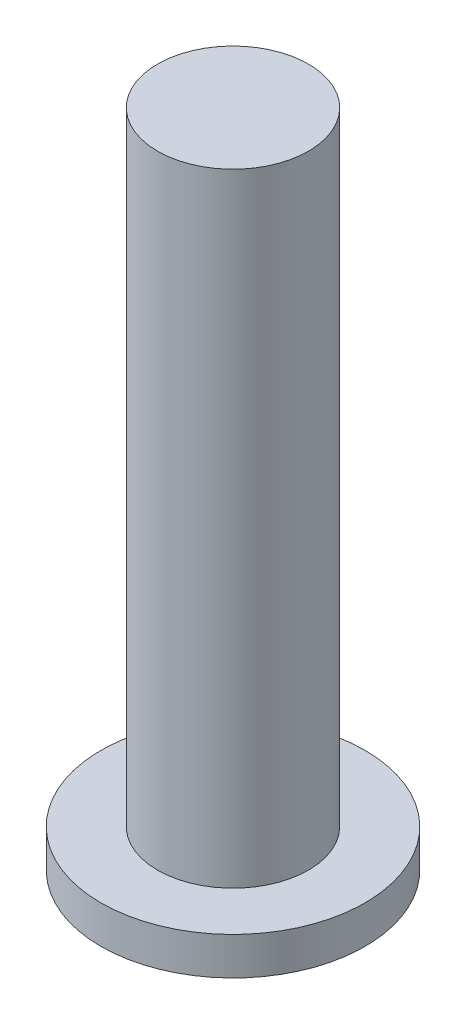
ISO-10303-21;
HEADER;
FILE_DESCRIPTION(('STEP AP214'),'2;1');
FILE_NAME('part.step','',(''),(''),'','','');
FILE_SCHEMA(('AUTOMOTIVE_DESIGN { 1 0 10303 214 1 1 1 1 }'));
ENDSEC;
DATA;
#1=APPLICATION_CONTEXT('core data for automotive mechanical design processes');
#2=APPLICATION_PROTOCOL_DEFINITION('international standard','automotive_design',2000,#1);
#3=PRODUCT_CONTEXT('',#1,'mechanical');
#4=PRODUCT('Part','Part','',(#3));
#5=PRODUCT_RELATED_PRODUCT_CATEGORY('part','',(#4));
#6=PRODUCT_DEFINITION_FORMATION('','',#4);
#7=PRODUCT_DEFINITION_CONTEXT('part definition',#1,'design');
#8=PRODUCT_DEFINITION('design','',#6,#7);
#9=PRODUCT_DEFINITION_SHAPE('','',#8);
#10=(LENGTH_UNIT() NAMED_UNIT(*) SI_UNIT(.MILLI.,.METRE.));
#11=(NAMED_UNIT(*) PLANE_ANGLE_UNIT() SI_UNIT($,.RADIAN.));
#12=(NAMED_UNIT(*) SI_UNIT($,.STERADIAN.) SOLID_ANGLE_UNIT());
#13=UNCERTAINTY_MEASURE_WITH_UNIT(LENGTH_MEASURE(1.E-05),#10,'distance_accuracy_value','');
#14=(GEOMETRIC_REPRESENTATION_CONTEXT(3) GLOBAL_UNCERTAINTY_ASSIGNED_CONTEXT((#13)) GLOBAL_UNIT_ASSIGNED_CONTEXT((#10,
#11,#12)) REPRESENTATION_CONTEXT('',''));
#15=CARTESIAN_POINT('',(0.,0.,0.));
#16=DIRECTION('',(0.,0.,1.));
#17=DIRECTION('',(1.,0.,0.));
#18=AXIS2_PLACEMENT_3D('',#15,#16,#17);
#19=CARTESIAN_POINT('',(0.,2.,0.));
#20=DIRECTION('',(0.,1.,0.));
#21=DIRECTION('',(0.,0.,1.));
#22=AXIS2_PLACEMENT_3D('',#19,#20,#21);
#23=PLANE('',#22);
#24=CARTESIAN_POINT('',(0.,2.,0.));
#25=DIRECTION('',(0.,1.,0.));
#26=DIRECTION('',(0.,0.,1.));
#27=AXIS2_PLACEMENT_3D('',#24,#25,#26);
#28=CIRCLE('',#27,7.);
#29=CARTESIAN_POINT('',(0.,2.,7.));
#30=VERTEX_POINT('',#29);
#31=EDGE_CURVE('E10',#30,#30,#28,.T.);
#32=ORIENTED_EDGE('',*,*,#31,.T.);
#33=EDGE_LOOP('',(#32));
#34=FACE_BOUND('',#33,.T.);
#35=CARTESIAN_POINT('',(0.,2.,0.));
#36=DIRECTION('',(0.,1.,0.));
#37=DIRECTION('',(0.,0.,1.));
#38=AXIS2_PLACEMENT_3D('',#35,#36,#37);
#39=CIRCLE('',#38,4.);
#40=CARTESIAN_POINT('',(0.,2.,4.));
#41=VERTEX_POINT('',#40);
#42=EDGE_CURVE('E46',#41,#41,#39,.T.);
#43=ORIENTED_EDGE('',*,*,#42,.F.);
#44=EDGE_LOOP('',(#43));
#45=FACE_BOUND('',#44,.T.);
#46=ADVANCED_FACE('F35',(#34,#45),#23,.T.);
#47=CARTESIAN_POINT('',(0.,0.,0.));
#48=DIRECTION('',(0.,1.,0.));
#49=DIRECTION('',(0.,0.,1.));
#50=AXIS2_PLACEMENT_3D('',#47,#48,#49);
#51=PLANE('',#50);
#52=CARTESIAN_POINT('',(0.,0.,0.));
#53=DIRECTION('',(0.,1.,0.));
#54=DIRECTION('',(0.,0.,1.));
#55=AXIS2_PLACEMENT_3D('',#52,#53,#54);
#56=CIRCLE('',#55,7.);
#57=CARTESIAN_POINT('',(0.,0.,7.));
#58=VERTEX_POINT('',#57);
#59=EDGE_CURVE('E39',#58,#58,#56,.T.);
#60=ORIENTED_EDGE('',*,*,#59,.F.);
#61=EDGE_LOOP('',(#60));
#62=FACE_BOUND('',#61,.T.);
#63=ADVANCED_FACE('F65',(#62),#51,.F.);
#64=CARTESIAN_POINT('',(0.,2.,0.));
#65=DIRECTION('',(0.,-1.,0.));
#66=DIRECTION('',(0.,0.,-1.));
#67=AXIS2_PLACEMENT_3D('',#64,#65,#66);
#68=CYLINDRICAL_SURFACE('',#67,7.);
#69=ORIENTED_EDGE('',*,*,#31,.F.);
#70=EDGE_LOOP('',(#69));
#71=FACE_BOUND('',#70,.T.);
#72=ORIENTED_EDGE('',*,*,#59,.T.);
#73=EDGE_LOOP('',(#72));
#74=FACE_BOUND('',#73,.T.);
#75=ADVANCED_FACE('F37',(#71,#74),#68,.T.);
#76=CARTESIAN_POINT('',(0.,35.,0.));
#77=DIRECTION('',(0.,-1.,0.));
#78=DIRECTION('',(0.,0.,-1.));
#79=AXIS2_PLACEMENT_3D('',#76,#77,#78);
#80=CYLINDRICAL_SURFACE('',#79,4.);
#81=ORIENTED_EDGE('',*,*,#42,.T.);
#82=EDGE_LOOP('',(#81));
#83=FACE_BOUND('',#82,.T.);
#84=CARTESIAN_POINT('',(0.,35.,0.));
#85=DIRECTION('',(0.,1.,0.));
#86=DIRECTION('',(0.,0.,1.));
#87=AXIS2_PLACEMENT_3D('',#84,#85,#86);
#88=CIRCLE('',#87,4.);
#89=CARTESIAN_POINT('',(0.,35.,4.));
#90=VERTEX_POINT('',#89);
#91=EDGE_CURVE('E50',#90,#90,#88,.T.);
#92=ORIENTED_EDGE('',*,*,#91,.F.);
#93=EDGE_LOOP('',(#92));
#94=FACE_BOUND('',#93,.T.);
#95=ADVANCED_FACE('F56',(#83,#94),#80,.T.);
#96=CARTESIAN_POINT('',(0.,35.,0.));
#97=DIRECTION('',(0.,1.,0.));
#98=DIRECTION('',(0.,0.,1.));
#99=AXIS2_PLACEMENT_3D('',#96,#97,#98);
#100=PLANE('',#99);
#101=ORIENTED_EDGE('',*,*,#91,.T.);
#102=EDGE_LOOP('',(#101));
#103=FACE_BOUND('',#102,.T.);
#104=ADVANCED_FACE('F54',(#103),#100,.T.);
#105=CLOSED_SHELL('',(#46,#63,#75,#95,#104));
#106=MANIFOLD_SOLID_BREP('B2',#105);
#107=ADVANCED_BREP_SHAPE_REPRESENTATION('',(#18,#106),#14);
#108=SHAPE_DEFINITION_REPRESENTATION(#9,#107);
ENDSEC;
END-ISO-10303-21;
